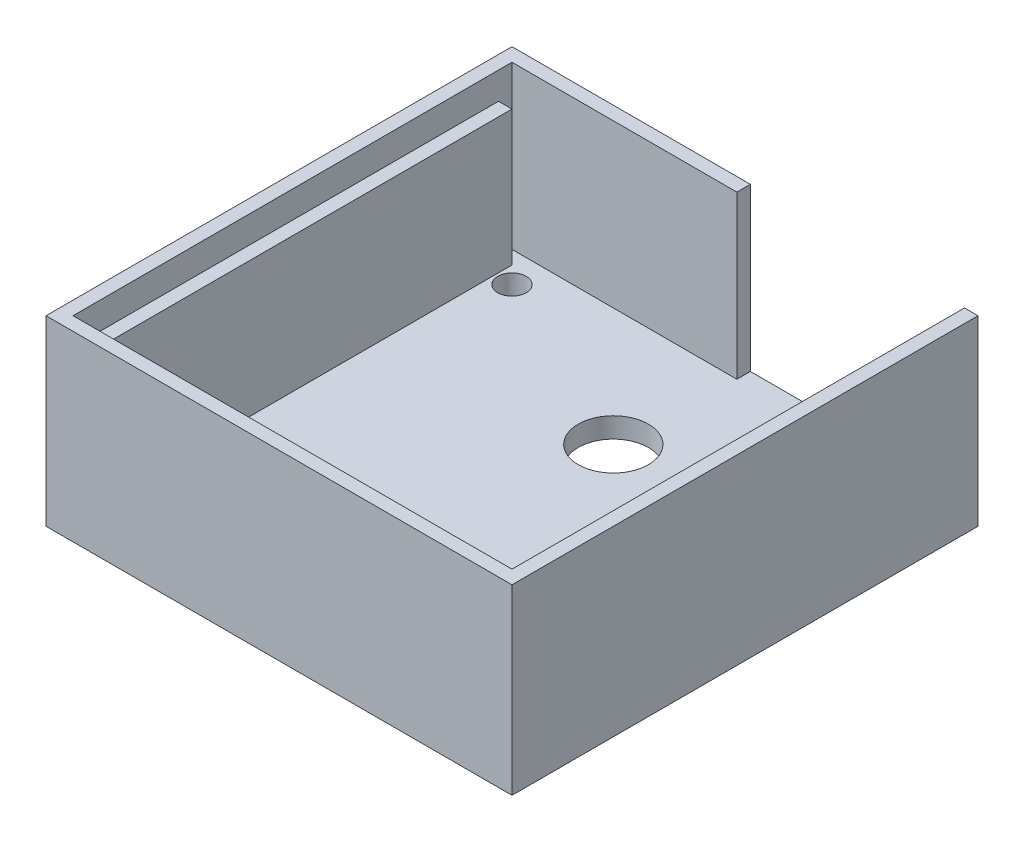
ISO-10303-21;
HEADER;
FILE_DESCRIPTION(('STEP AP214'),'2;1');
FILE_NAME('part.step','',(''),(''),'','','');
FILE_SCHEMA(('AUTOMOTIVE_DESIGN { 1 0 10303 214 1 1 1 1 }'));
ENDSEC;
DATA;
#1=APPLICATION_CONTEXT('core data for automotive mechanical design processes');
#2=APPLICATION_PROTOCOL_DEFINITION('international standard','automotive_design',2000,#1);
#3=PRODUCT_CONTEXT('',#1,'mechanical');
#4=PRODUCT('Part','Part','',(#3));
#5=PRODUCT_RELATED_PRODUCT_CATEGORY('part','',(#4));
#6=PRODUCT_DEFINITION_FORMATION('','',#4);
#7=PRODUCT_DEFINITION_CONTEXT('part definition',#1,'design');
#8=PRODUCT_DEFINITION('design','',#6,#7);
#9=PRODUCT_DEFINITION_SHAPE('','',#8);
#10=(LENGTH_UNIT() NAMED_UNIT(*) SI_UNIT(.MILLI.,.METRE.));
#11=(NAMED_UNIT(*) PLANE_ANGLE_UNIT() SI_UNIT($,.RADIAN.));
#12=(NAMED_UNIT(*) SI_UNIT($,.STERADIAN.) SOLID_ANGLE_UNIT());
#13=UNCERTAINTY_MEASURE_WITH_UNIT(LENGTH_MEASURE(1.E-05),#10,'distance_accuracy_value','');
#14=(GEOMETRIC_REPRESENTATION_CONTEXT(3) GLOBAL_UNCERTAINTY_ASSIGNED_CONTEXT((#13)) GLOBAL_UNIT_ASSIGNED_CONTEXT((#10,
#11,#12)) REPRESENTATION_CONTEXT('',''));
#15=CARTESIAN_POINT('',(0.,0.,0.));
#16=DIRECTION('',(0.,0.,1.));
#17=DIRECTION('',(1.,0.,0.));
#18=AXIS2_PLACEMENT_3D('',#15,#16,#17);
#19=CARTESIAN_POINT('',(0.,11.5,0.));
#20=DIRECTION('',(0.,1.,0.));
#21=DIRECTION('',(0.,0.,1.));
#22=AXIS2_PLACEMENT_3D('',#19,#20,#21);
#23=PLANE('',#22);
#24=DIRECTION('',(0.,0.,-1.));
#25=VECTOR('',#24,1.);
#26=CARTESIAN_POINT('',(14.5,11.5,-1.99999999999999));
#27=LINE('',#26,#25);
#28=CARTESIAN_POINT('',(14.5,11.5,-0.999999999999997));
#29=VERTEX_POINT('',#28);
#30=CARTESIAN_POINT('',(14.5,11.5,-1.99999999999999));
#31=VERTEX_POINT('',#30);
#32=EDGE_CURVE('E401',#29,#31,#27,.T.);
#33=ORIENTED_EDGE('',*,*,#32,.F.);
#34=DIRECTION('',(1.,0.,0.));
#35=VECTOR('',#34,1.);
#36=CARTESIAN_POINT('',(0.999999999999999,11.5,-0.999999999999997));
#37=LINE('',#36,#35);
#38=CARTESIAN_POINT('',(33.5,11.5,-1.));
#39=VERTEX_POINT('',#38);
#40=EDGE_CURVE('E217',#29,#39,#37,.T.);
#41=ORIENTED_EDGE('',*,*,#40,.T.);
#42=DIRECTION('',(0.,0.,-1.));
#43=VECTOR('',#42,1.);
#44=CARTESIAN_POINT('',(33.5,11.5,-1.));
#45=LINE('',#44,#43);
#46=CARTESIAN_POINT('',(33.5,11.5,-32.4840261778756));
#47=VERTEX_POINT('',#46);
#48=EDGE_CURVE('E222',#39,#47,#45,.T.);
#49=ORIENTED_EDGE('',*,*,#48,.T.);
#50=DIRECTION('',(1.,0.,0.));
#51=VECTOR('',#50,1.);
#52=CARTESIAN_POINT('',(0.,11.5,-32.4840261778756));
#53=LINE('',#52,#51);
#54=CARTESIAN_POINT('',(32.5,11.5,-32.4840261778756));
#55=VERTEX_POINT('',#54);
#56=EDGE_CURVE('E308',#55,#47,#53,.T.);
#57=ORIENTED_EDGE('',*,*,#56,.F.);
#58=DIRECTION('',(0.,0.,-1.));
#59=VECTOR('',#58,1.);
#60=CARTESIAN_POINT('',(32.5,11.5,-1.99999999999999));
#61=LINE('',#60,#59);
#62=CARTESIAN_POINT('',(32.5,11.5,-1.99999999999999));
#63=VERTEX_POINT('',#62);
#64=EDGE_CURVE('E358',#63,#55,#61,.T.);
#65=ORIENTED_EDGE('',*,*,#64,.F.);
#66=DIRECTION('',(1.,0.,0.));
#67=VECTOR('',#66,1.);
#68=CARTESIAN_POINT('',(1.99999999999998,11.5,-1.99999999999999));
#69=LINE('',#68,#67);
#70=EDGE_CURVE('E360',#31,#63,#69,.T.);
#71=ORIENTED_EDGE('',*,*,#70,.F.);
#72=EDGE_LOOP('',(#33,#41,#49,#57,#65,#71));
#73=FACE_BOUND('',#72,.T.);
#74=ADVANCED_FACE('F37',(#73),#23,.T.);
#75=CARTESIAN_POINT('',(1.99999999999998,-43.1335136523794,-1.99999999999999));
#76=DIRECTION('',(0.,0.,1.));
#77=DIRECTION('',(1.,0.,0.));
#78=AXIS2_PLACEMENT_3D('',#75,#76,#77);
#79=PLANE('',#78);
#80=DIRECTION('',(1.,0.,0.));
#81=VECTOR('',#80,1.);
#82=CARTESIAN_POINT('',(1.99999999999998,1.5,-1.99999999999999));
#83=LINE('',#82,#81);
#84=CARTESIAN_POINT('',(14.5,1.5,-1.99999999999999));
#85=VERTEX_POINT('',#84);
#86=CARTESIAN_POINT('',(32.5,1.5,-1.99999999999999));
#87=VERTEX_POINT('',#86);
#88=EDGE_CURVE('E201',#85,#87,#83,.T.);
#89=ORIENTED_EDGE('',*,*,#88,.F.);
#90=DIRECTION('',(0.,1.,0.));
#91=VECTOR('',#90,1.);
#92=CARTESIAN_POINT('',(14.5,1.5,-1.99999999999999));
#93=LINE('',#92,#91);
#94=EDGE_CURVE('E192',#85,#31,#93,.T.);
#95=ORIENTED_EDGE('',*,*,#94,.T.);
#96=ORIENTED_EDGE('',*,*,#70,.T.);
#97=DIRECTION('',(0.,1.,0.));
#98=VECTOR('',#97,1.);
#99=CARTESIAN_POINT('',(32.5,-43.1335136523794,-1.99999999999999));
#100=LINE('',#99,#98);
#101=EDGE_CURVE('E200',#87,#63,#100,.T.);
#102=ORIENTED_EDGE('',*,*,#101,.F.);
#103=EDGE_LOOP('',(#89,#95,#96,#102));
#104=FACE_BOUND('',#103,.T.);
#105=ADVANCED_FACE('F413',(#104),#79,.F.);
#106=CARTESIAN_POINT('',(0.,13.5,0.));
#107=DIRECTION('',(1.,0.,0.));
#108=DIRECTION('',(0.,0.,-1.));
#109=AXIS2_PLACEMENT_3D('',#106,#107,#108);
#110=PLANE('',#109);
#111=DIRECTION('',(0.,0.,1.));
#112=VECTOR('',#111,1.);
#113=CARTESIAN_POINT('',(0.,0.,0.));
#114=LINE('',#113,#112);
#115=CARTESIAN_POINT('',(0.,0.,-34.5));
#116=VERTEX_POINT('',#115);
#117=CARTESIAN_POINT('',(0.,0.,0.));
#118=VERTEX_POINT('',#117);
#119=EDGE_CURVE('E237',#116,#118,#114,.T.);
#120=ORIENTED_EDGE('',*,*,#119,.T.);
#121=DIRECTION('',(0.,-1.,0.));
#122=VECTOR('',#121,1.);
#123=CARTESIAN_POINT('',(0.,13.5,0.));
#124=LINE('',#123,#122);
#125=CARTESIAN_POINT('',(0.,13.5,0.));
#126=VERTEX_POINT('',#125);
#127=EDGE_CURVE('E45',#126,#118,#124,.T.);
#128=ORIENTED_EDGE('',*,*,#127,.F.);
#129=DIRECTION('',(0.,0.,1.));
#130=VECTOR('',#129,1.);
#131=CARTESIAN_POINT('',(0.,13.5,0.));
#132=LINE('',#131,#130);
#133=CARTESIAN_POINT('',(0.,13.5,-34.5));
#134=VERTEX_POINT('',#133);
#135=EDGE_CURVE('E242',#134,#126,#132,.T.);
#136=ORIENTED_EDGE('',*,*,#135,.F.);
#137=DIRECTION('',(0.,-1.,0.));
#138=VECTOR('',#137,1.);
#139=CARTESIAN_POINT('',(0.,13.5,-34.5));
#140=LINE('',#139,#138);
#141=EDGE_CURVE('E254',#134,#116,#140,.T.);
#142=ORIENTED_EDGE('',*,*,#141,.T.);
#143=EDGE_LOOP('',(#120,#128,#136,#142));
#144=FACE_BOUND('',#143,.T.);
#145=ADVANCED_FACE('F39',(#144),#110,.F.);
#146=CARTESIAN_POINT('',(0.,13.5,0.));
#147=DIRECTION('',(0.,0.,-1.));
#148=DIRECTION('',(-1.,0.,0.));
#149=AXIS2_PLACEMENT_3D('',#146,#147,#148);
#150=PLANE('',#149);
#151=DIRECTION('',(1.,0.,0.));
#152=VECTOR('',#151,1.);
#153=CARTESIAN_POINT('',(0.,0.,0.));
#154=LINE('',#153,#152);
#155=CARTESIAN_POINT('',(34.5,0.,0.));
#156=VERTEX_POINT('',#155);
#157=EDGE_CURVE('E257',#118,#156,#154,.T.);
#158=ORIENTED_EDGE('',*,*,#157,.T.);
#159=DIRECTION('',(0.,-1.,0.));
#160=VECTOR('',#159,1.);
#161=CARTESIAN_POINT('',(34.5,13.5,0.));
#162=LINE('',#161,#160);
#163=CARTESIAN_POINT('',(34.5,13.5,0.));
#164=VERTEX_POINT('',#163);
#165=EDGE_CURVE('E267',#164,#156,#162,.T.);
#166=ORIENTED_EDGE('',*,*,#165,.F.);
#167=DIRECTION('',(1.,0.,0.));
#168=VECTOR('',#167,1.);
#169=CARTESIAN_POINT('',(0.,13.5,0.));
#170=LINE('',#169,#168);
#171=EDGE_CURVE('E245',#126,#164,#170,.T.);
#172=ORIENTED_EDGE('',*,*,#171,.F.);
#173=ORIENTED_EDGE('',*,*,#127,.T.);
#174=EDGE_LOOP('',(#158,#166,#172,#173));
#175=FACE_BOUND('',#174,.T.);
#176=ADVANCED_FACE('F272',(#175),#150,.F.);
#177=CARTESIAN_POINT('',(34.5,13.5,0.));
#178=DIRECTION('',(-1.,0.,0.));
#179=DIRECTION('',(0.,0.,1.));
#180=AXIS2_PLACEMENT_3D('',#177,#178,#179);
#181=PLANE('',#180);
#182=DIRECTION('',(0.,0.,-1.));
#183=VECTOR('',#182,1.);
#184=CARTESIAN_POINT('',(34.5,0.,0.));
#185=LINE('',#184,#183);
#186=CARTESIAN_POINT('',(34.5,0.,-34.5));
#187=VERTEX_POINT('',#186);
#188=EDGE_CURVE('E259',#156,#187,#185,.T.);
#189=ORIENTED_EDGE('',*,*,#188,.T.);
#190=DIRECTION('',(0.,-1.,0.));
#191=VECTOR('',#190,1.);
#192=CARTESIAN_POINT('',(34.5,13.5,-34.5));
#193=LINE('',#192,#191);
#194=CARTESIAN_POINT('',(34.5,13.5,-34.5));
#195=VERTEX_POINT('',#194);
#196=EDGE_CURVE('E264',#195,#187,#193,.T.);
#197=ORIENTED_EDGE('',*,*,#196,.F.);
#198=DIRECTION('',(0.,0.,-1.));
#199=VECTOR('',#198,1.);
#200=CARTESIAN_POINT('',(34.5,13.5,0.));
#201=LINE('',#200,#199);
#202=EDGE_CURVE('E248',#164,#195,#201,.T.);
#203=ORIENTED_EDGE('',*,*,#202,.F.);
#204=ORIENTED_EDGE('',*,*,#165,.T.);
#205=EDGE_LOOP('',(#189,#197,#203,#204));
#206=FACE_BOUND('',#205,.T.);
#207=ADVANCED_FACE('F284',(#206),#181,.F.);
#208=CARTESIAN_POINT('',(0.,13.5,-34.5));
#209=DIRECTION('',(0.,0.,1.));
#210=DIRECTION('',(1.,0.,0.));
#211=AXIS2_PLACEMENT_3D('',#208,#209,#210);
#212=PLANE('',#211);
#213=DIRECTION('',(-1.,0.,0.));
#214=VECTOR('',#213,1.);
#215=CARTESIAN_POINT('',(17.65,1.5,-34.5));
#216=LINE('',#215,#214);
#217=CARTESIAN_POINT('',(33.5,1.5,-34.5));
#218=VERTEX_POINT('',#217);
#219=CARTESIAN_POINT('',(17.65,1.5,-34.5));
#220=VERTEX_POINT('',#219);
#221=EDGE_CURVE('E303',#218,#220,#216,.T.);
#222=ORIENTED_EDGE('',*,*,#221,.F.);
#223=DIRECTION('',(0.,1.,0.));
#224=VECTOR('',#223,1.);
#225=CARTESIAN_POINT('',(33.5,-14.4776922755287,-34.5));
#226=LINE('',#225,#224);
#227=CARTESIAN_POINT('',(33.5,13.5,-34.5));
#228=VERTEX_POINT('',#227);
#229=EDGE_CURVE('E291',#218,#228,#226,.T.);
#230=ORIENTED_EDGE('',*,*,#229,.T.);
#231=DIRECTION('',(-1.,0.,0.));
#232=VECTOR('',#231,1.);
#233=CARTESIAN_POINT('',(0.,13.5,-34.5));
#234=LINE('',#233,#232);
#235=EDGE_CURVE('E251',#195,#228,#234,.T.);
#236=ORIENTED_EDGE('',*,*,#235,.F.);
#237=ORIENTED_EDGE('',*,*,#196,.T.);
#238=DIRECTION('',(-1.,0.,0.));
#239=VECTOR('',#238,1.);
#240=CARTESIAN_POINT('',(0.,0.,-34.5));
#241=LINE('',#240,#239);
#242=EDGE_CURVE('E246',#187,#116,#241,.T.);
#243=ORIENTED_EDGE('',*,*,#242,.T.);
#244=ORIENTED_EDGE('',*,*,#141,.F.);
#245=CARTESIAN_POINT('',(17.65,13.5,-34.5));
#246=VERTEX_POINT('',#245);
#247=EDGE_CURVE('E250',#246,#134,#234,.T.);
#248=ORIENTED_EDGE('',*,*,#247,.F.);
#249=DIRECTION('',(0.,1.,0.));
#250=VECTOR('',#249,1.);
#251=CARTESIAN_POINT('',(17.65,-14.4776922755287,-34.5));
#252=LINE('',#251,#250);
#253=EDGE_CURVE('E301',#220,#246,#252,.T.);
#254=ORIENTED_EDGE('',*,*,#253,.F.);
#255=EDGE_LOOP('',(#222,#230,#236,#237,#243,#244,#248,#254));
#256=FACE_BOUND('',#255,.T.);
#257=ADVANCED_FACE('F289',(#256),#212,.F.);
#258=CARTESIAN_POINT('',(0.,13.5,0.));
#259=DIRECTION('',(0.,-1.,0.));
#260=DIRECTION('',(0.,0.,-1.));
#261=AXIS2_PLACEMENT_3D('',#258,#259,#260);
#262=PLANE('',#261);
#263=ORIENTED_EDGE('',*,*,#235,.T.);
#264=DIRECTION('',(0.,0.,-1.));
#265=VECTOR('',#264,1.);
#266=CARTESIAN_POINT('',(33.5,13.5,-1.));
#267=LINE('',#266,#265);
#268=CARTESIAN_POINT('',(33.5,13.5,-1.));
#269=VERTEX_POINT('',#268);
#270=EDGE_CURVE('E218',#269,#228,#267,.T.);
#271=ORIENTED_EDGE('',*,*,#270,.F.);
#272=DIRECTION('',(1.,0.,0.));
#273=VECTOR('',#272,1.);
#274=CARTESIAN_POINT('',(0.999999999999999,13.5,-0.999999999999997));
#275=LINE('',#274,#273);
#276=CARTESIAN_POINT('',(0.999999999999999,13.5,-0.999999999999997));
#277=VERTEX_POINT('',#276);
#278=EDGE_CURVE('E231',#277,#269,#275,.T.);
#279=ORIENTED_EDGE('',*,*,#278,.F.);
#280=DIRECTION('',(0.,0.,1.));
#281=VECTOR('',#280,1.);
#282=CARTESIAN_POINT('',(0.999999999999997,13.5,-33.5));
#283=LINE('',#282,#281);
#284=CARTESIAN_POINT('',(0.999999999999997,13.5,-33.5));
#285=VERTEX_POINT('',#284);
#286=EDGE_CURVE('E228',#285,#277,#283,.T.);
#287=ORIENTED_EDGE('',*,*,#286,.F.);
#288=DIRECTION('',(-1.,0.,0.));
#289=VECTOR('',#288,1.);
#290=CARTESIAN_POINT('',(33.5,13.5,-33.5));
#291=LINE('',#290,#289);
#292=CARTESIAN_POINT('',(17.65,13.5,-33.5));
#293=VERTEX_POINT('',#292);
#294=EDGE_CURVE('E226',#293,#285,#291,.T.);
#295=ORIENTED_EDGE('',*,*,#294,.F.);
#296=DIRECTION('',(0.,0.,1.));
#297=VECTOR('',#296,1.);
#298=CARTESIAN_POINT('',(17.65,13.5,-34.5));
#299=LINE('',#298,#297);
#300=EDGE_CURVE('E299',#246,#293,#299,.T.);
#301=ORIENTED_EDGE('',*,*,#300,.F.);
#302=ORIENTED_EDGE('',*,*,#247,.T.);
#303=ORIENTED_EDGE('',*,*,#135,.T.);
#304=ORIENTED_EDGE('',*,*,#171,.T.);
#305=ORIENTED_EDGE('',*,*,#202,.T.);
#306=EDGE_LOOP('',(#263,#271,#279,#287,#295,#301,#302,#303,#304,#305));
#307=FACE_BOUND('',#306,.T.);
#308=ADVANCED_FACE('F294',(#307),#262,.F.);
#309=CARTESIAN_POINT('',(0.,0.,0.));
#310=DIRECTION('',(0.,-1.,0.));
#311=DIRECTION('',(0.,0.,-1.));
#312=AXIS2_PLACEMENT_3D('',#309,#310,#311);
#313=PLANE('',#312);
#314=CARTESIAN_POINT('',(31.25,0.,-31.25));
#315=DIRECTION('',(0.,-1.,0.));
#316=DIRECTION('',(0.,0.,-1.));
#317=AXIS2_PLACEMENT_3D('',#314,#315,#316);
#318=CIRCLE('',#317,1.0552593244145);
#319=CARTESIAN_POINT('',(31.25,0.,-32.3052593244145));
#320=VERTEX_POINT('',#319);
#321=EDGE_CURVE('E355',#320,#320,#318,.T.);
#322=ORIENTED_EDGE('',*,*,#321,.F.);
#323=EDGE_LOOP('',(#322));
#324=FACE_BOUND('',#323,.T.);
#325=CARTESIAN_POINT('',(31.25,0.,-3.24999999999999));
#326=DIRECTION('',(0.,-1.,0.));
#327=DIRECTION('',(0.,0.,-1.));
#328=AXIS2_PLACEMENT_3D('',#325,#326,#327);
#329=CIRCLE('',#328,1.0552593244145);
#330=CARTESIAN_POINT('',(31.25,0.,-4.30525932441449));
#331=VERTEX_POINT('',#330);
#332=EDGE_CURVE('E352',#331,#331,#329,.T.);
#333=ORIENTED_EDGE('',*,*,#332,.F.);
#334=EDGE_LOOP('',(#333));
#335=FACE_BOUND('',#334,.T.);
#336=CARTESIAN_POINT('',(3.24999999999999,0.,-3.25));
#337=DIRECTION('',(0.,-1.,0.));
#338=DIRECTION('',(0.,0.,-1.));
#339=AXIS2_PLACEMENT_3D('',#336,#337,#338);
#340=CIRCLE('',#339,1.0552593244145);
#341=CARTESIAN_POINT('',(3.24999999999999,0.,-4.30525932441449));
#342=VERTEX_POINT('',#341);
#343=EDGE_CURVE('E349',#342,#342,#340,.T.);
#344=ORIENTED_EDGE('',*,*,#343,.F.);
#345=EDGE_LOOP('',(#344));
#346=FACE_BOUND('',#345,.T.);
#347=CARTESIAN_POINT('',(17.25,0.,-24.75));
#348=DIRECTION('',(0.,-1.,0.));
#349=DIRECTION('',(0.,0.,-1.));
#350=AXIS2_PLACEMENT_3D('',#347,#348,#349);
#351=CIRCLE('',#350,2.6);
#352=CARTESIAN_POINT('',(17.25,0.,-27.35));
#353=VERTEX_POINT('',#352);
#354=EDGE_CURVE('E346',#353,#353,#351,.T.);
#355=ORIENTED_EDGE('',*,*,#354,.F.);
#356=EDGE_LOOP('',(#355));
#357=FACE_BOUND('',#356,.T.);
#358=CARTESIAN_POINT('',(17.25,0.,-9.74999999999999));
#359=DIRECTION('',(0.,-1.,0.));
#360=DIRECTION('',(0.,0.,-1.));
#361=AXIS2_PLACEMENT_3D('',#358,#359,#360);
#362=CIRCLE('',#361,2.59999999999999);
#363=CARTESIAN_POINT('',(17.25,0.,-12.35));
#364=VERTEX_POINT('',#363);
#365=EDGE_CURVE('E343',#364,#364,#362,.T.);
#366=ORIENTED_EDGE('',*,*,#365,.F.);
#367=EDGE_LOOP('',(#366));
#368=FACE_BOUND('',#367,.T.);
#369=CARTESIAN_POINT('',(3.24999999999999,0.,-31.25));
#370=DIRECTION('',(0.,-1.,0.));
#371=DIRECTION('',(0.,0.,-1.));
#372=AXIS2_PLACEMENT_3D('',#369,#370,#371);
#373=CIRCLE('',#372,1.0552593244145);
#374=CARTESIAN_POINT('',(3.24999999999999,0.,-32.3052593244145));
#375=VERTEX_POINT('',#374);
#376=EDGE_CURVE('E340',#375,#375,#373,.T.);
#377=ORIENTED_EDGE('',*,*,#376,.F.);
#378=EDGE_LOOP('',(#377));
#379=FACE_BOUND('',#378,.T.);
#380=ORIENTED_EDGE('',*,*,#119,.F.);
#381=ORIENTED_EDGE('',*,*,#242,.F.);
#382=ORIENTED_EDGE('',*,*,#188,.F.);
#383=ORIENTED_EDGE('',*,*,#157,.F.);
#384=EDGE_LOOP('',(#380,#381,#382,#383));
#385=FACE_BOUND('',#384,.T.);
#386=ADVANCED_FACE('F280',(#324,#335,#346,#357,#368,#379,#385),#313,.T.);
#387=CARTESIAN_POINT('',(33.5,11.5,-33.5));
#388=DIRECTION('',(0.,0.,-1.));
#389=DIRECTION('',(-1.,0.,0.));
#390=AXIS2_PLACEMENT_3D('',#387,#388,#389);
#391=PLANE('',#390);
#392=DIRECTION('',(0.,1.,0.));
#393=VECTOR('',#392,1.);
#394=CARTESIAN_POINT('',(0.999999999999997,11.5,-33.5));
#395=LINE('',#394,#393);
#396=CARTESIAN_POINT('',(0.999999999999997,1.5,-33.5));
#397=VERTEX_POINT('',#396);
#398=EDGE_CURVE('E225',#397,#285,#395,.T.);
#399=ORIENTED_EDGE('',*,*,#398,.F.);
#400=DIRECTION('',(-1.,0.,0.));
#401=VECTOR('',#400,1.);
#402=CARTESIAN_POINT('',(17.65,1.5,-33.5));
#403=LINE('',#402,#401);
#404=CARTESIAN_POINT('',(17.65,1.5,-33.5));
#405=VERTEX_POINT('',#404);
#406=EDGE_CURVE('E387',#405,#397,#403,.T.);
#407=ORIENTED_EDGE('',*,*,#406,.F.);
#408=DIRECTION('',(0.,1.,0.));
#409=VECTOR('',#408,1.);
#410=CARTESIAN_POINT('',(17.65,11.5,-33.5));
#411=LINE('',#410,#409);
#412=EDGE_CURVE('E319',#405,#293,#411,.T.);
#413=ORIENTED_EDGE('',*,*,#412,.T.);
#414=ORIENTED_EDGE('',*,*,#294,.T.);
#415=EDGE_LOOP('',(#399,#407,#413,#414));
#416=FACE_BOUND('',#415,.T.);
#417=ADVANCED_FACE('F442',(#416),#391,.F.);
#418=CARTESIAN_POINT('',(33.5,11.5,-1.));
#419=DIRECTION('',(1.,0.,0.));
#420=DIRECTION('',(0.,0.,-1.));
#421=AXIS2_PLACEMENT_3D('',#418,#419,#420);
#422=PLANE('',#421);
#423=ORIENTED_EDGE('',*,*,#270,.T.);
#424=ORIENTED_EDGE('',*,*,#229,.F.);
#425=DIRECTION('',(0.,0.,-1.));
#426=VECTOR('',#425,1.);
#427=CARTESIAN_POINT('',(33.5,1.5,-34.5));
#428=LINE('',#427,#426);
#429=CARTESIAN_POINT('',(33.5,1.5,-32.4840261778756));
#430=VERTEX_POINT('',#429);
#431=EDGE_CURVE('E313',#430,#218,#428,.T.);
#432=ORIENTED_EDGE('',*,*,#431,.F.);
#433=DIRECTION('',(0.,1.,0.));
#434=VECTOR('',#433,1.);
#435=CARTESIAN_POINT('',(33.5,-14.4776922755287,-32.4840261778756));
#436=LINE('',#435,#434);
#437=EDGE_CURVE('E315',#430,#47,#436,.T.);
#438=ORIENTED_EDGE('',*,*,#437,.T.);
#439=ORIENTED_EDGE('',*,*,#48,.F.);
#440=DIRECTION('',(0.,1.,0.));
#441=VECTOR('',#440,1.);
#442=CARTESIAN_POINT('',(33.5,11.5,-1.));
#443=LINE('',#442,#441);
#444=EDGE_CURVE('E235',#39,#269,#443,.T.);
#445=ORIENTED_EDGE('',*,*,#444,.T.);
#446=EDGE_LOOP('',(#423,#424,#432,#438,#439,#445));
#447=FACE_BOUND('',#446,.T.);
#448=ADVANCED_FACE('F377',(#447),#422,.F.);
#449=CARTESIAN_POINT('',(0.999999999999999,11.5,-0.999999999999997));
#450=DIRECTION('',(0.,0.,1.));
#451=DIRECTION('',(1.,0.,0.));
#452=AXIS2_PLACEMENT_3D('',#449,#450,#451);
#453=PLANE('',#452);
#454=ORIENTED_EDGE('',*,*,#278,.T.);
#455=ORIENTED_EDGE('',*,*,#444,.F.);
#456=ORIENTED_EDGE('',*,*,#40,.F.);
#457=DIRECTION('',(0.,1.,0.));
#458=VECTOR('',#457,1.);
#459=CARTESIAN_POINT('',(14.5,1.5,-0.999999999999997));
#460=LINE('',#459,#458);
#461=CARTESIAN_POINT('',(14.5,1.5,-0.999999999999997));
#462=VERTEX_POINT('',#461);
#463=EDGE_CURVE('E388',#462,#29,#460,.T.);
#464=ORIENTED_EDGE('',*,*,#463,.F.);
#465=DIRECTION('',(1.,0.,0.));
#466=VECTOR('',#465,1.);
#467=CARTESIAN_POINT('',(14.5,1.5,-0.999999999999997));
#468=LINE('',#467,#466);
#469=CARTESIAN_POINT('',(5.,1.5,-0.999999999999997));
#470=VERTEX_POINT('',#469);
#471=EDGE_CURVE('E182',#470,#462,#468,.T.);
#472=ORIENTED_EDGE('',*,*,#471,.F.);
#473=DIRECTION('',(0.,1.,0.));
#474=VECTOR('',#473,1.);
#475=CARTESIAN_POINT('',(5.,1.5,-0.999999999999997));
#476=LINE('',#475,#474);
#477=CARTESIAN_POINT('',(5.,11.5,-0.999999999999997));
#478=VERTEX_POINT('',#477);
#479=EDGE_CURVE('E179',#470,#478,#476,.T.);
#480=ORIENTED_EDGE('',*,*,#479,.T.);
#481=CARTESIAN_POINT('',(0.999999999999999,11.5,-0.999999999999997));
#482=VERTEX_POINT('',#481);
#483=EDGE_CURVE('E219',#482,#478,#37,.T.);
#484=ORIENTED_EDGE('',*,*,#483,.F.);
#485=DIRECTION('',(0.,1.,0.));
#486=VECTOR('',#485,1.);
#487=CARTESIAN_POINT('',(0.999999999999999,11.5,-0.999999999999997));
#488=LINE('',#487,#486);
#489=EDGE_CURVE('E238',#482,#277,#488,.T.);
#490=ORIENTED_EDGE('',*,*,#489,.T.);
#491=EDGE_LOOP('',(#454,#455,#456,#464,#472,#480,#484,#490));
#492=FACE_BOUND('',#491,.T.);
#493=ADVANCED_FACE('F405',(#492),#453,.F.);
#494=CARTESIAN_POINT('',(0.999999999999997,11.5,-33.5));
#495=DIRECTION('',(-1.,0.,0.));
#496=DIRECTION('',(0.,0.,1.));
#497=AXIS2_PLACEMENT_3D('',#494,#495,#496);
#498=PLANE('',#497);
#499=ORIENTED_EDGE('',*,*,#286,.T.);
#500=ORIENTED_EDGE('',*,*,#489,.F.);
#501=DIRECTION('',(0.,0.,1.));
#502=VECTOR('',#501,1.);
#503=CARTESIAN_POINT('',(0.999999999999997,11.5,-33.5));
#504=LINE('',#503,#502);
#505=CARTESIAN_POINT('',(0.999999999999997,11.5,-32.5));
#506=VERTEX_POINT('',#505);
#507=EDGE_CURVE('E215',#506,#482,#504,.T.);
#508=ORIENTED_EDGE('',*,*,#507,.F.);
#509=DIRECTION('',(0.,1.,0.));
#510=VECTOR('',#509,1.);
#511=CARTESIAN_POINT('',(0.999999999999997,1.5,-32.5));
#512=LINE('',#511,#510);
#513=CARTESIAN_POINT('',(0.999999999999997,1.5,-32.5));
#514=VERTEX_POINT('',#513);
#515=EDGE_CURVE('E380',#514,#506,#512,.T.);
#516=ORIENTED_EDGE('',*,*,#515,.F.);
#517=DIRECTION('',(0.,0.,1.));
#518=VECTOR('',#517,1.);
#519=CARTESIAN_POINT('',(0.999999999999997,1.5,-32.5));
#520=LINE('',#519,#518);
#521=EDGE_CURVE('E390',#397,#514,#520,.T.);
#522=ORIENTED_EDGE('',*,*,#521,.F.);
#523=ORIENTED_EDGE('',*,*,#398,.T.);
#524=EDGE_LOOP('',(#499,#500,#508,#516,#522,#523));
#525=FACE_BOUND('',#524,.T.);
#526=ADVANCED_FACE('F438',(#525),#498,.F.);
#527=DIRECTION('',(0.,0.,1.));
#528=VECTOR('',#527,1.);
#529=CARTESIAN_POINT('',(5.,11.5,-1.99999999999999));
#530=LINE('',#529,#528);
#531=CARTESIAN_POINT('',(5.,11.5,-1.99999999999999));
#532=VERTEX_POINT('',#531);
#533=EDGE_CURVE('E399',#532,#478,#530,.T.);
#534=ORIENTED_EDGE('',*,*,#533,.F.);
#535=CARTESIAN_POINT('',(1.99999999999998,11.5,-1.99999999999999));
#536=VERTEX_POINT('',#535);
#537=EDGE_CURVE('E191',#536,#532,#69,.T.);
#538=ORIENTED_EDGE('',*,*,#537,.F.);
#539=DIRECTION('',(0.,0.,1.));
#540=VECTOR('',#539,1.);
#541=CARTESIAN_POINT('',(1.99999999999998,11.5,-1.99999999999999));
#542=LINE('',#541,#540);
#543=CARTESIAN_POINT('',(1.99999999999998,11.5,-32.5));
#544=VERTEX_POINT('',#543);
#545=EDGE_CURVE('E361',#544,#536,#542,.T.);
#546=ORIENTED_EDGE('',*,*,#545,.F.);
#547=DIRECTION('',(1.,0.,0.));
#548=VECTOR('',#547,1.);
#549=CARTESIAN_POINT('',(17.65,11.5,-32.5));
#550=LINE('',#549,#548);
#551=EDGE_CURVE('E385',#506,#544,#550,.T.);
#552=ORIENTED_EDGE('',*,*,#551,.F.);
#553=ORIENTED_EDGE('',*,*,#507,.T.);
#554=ORIENTED_EDGE('',*,*,#483,.T.);
#555=EDGE_LOOP('',(#534,#538,#546,#552,#553,#554));
#556=FACE_BOUND('',#555,.T.);
#557=ADVANCED_FACE('F421',(#556),#23,.T.);
#558=CARTESIAN_POINT('',(0.,1.5,0.));
#559=DIRECTION('',(0.,-1.,0.));
#560=DIRECTION('',(0.,0.,-1.));
#561=AXIS2_PLACEMENT_3D('',#558,#559,#560);
#562=PLANE('',#561);
#563=DIRECTION('',(1.,0.,0.));
#564=VECTOR('',#563,1.);
#565=CARTESIAN_POINT('',(17.65,1.5,-32.5));
#566=LINE('',#565,#564);
#567=CARTESIAN_POINT('',(1.99999999999998,1.5,-32.5));
#568=VERTEX_POINT('',#567);
#569=EDGE_CURVE('E384',#514,#568,#566,.T.);
#570=ORIENTED_EDGE('',*,*,#569,.T.);
#571=DIRECTION('',(0.,0.,1.));
#572=VECTOR('',#571,1.);
#573=CARTESIAN_POINT('',(1.99999999999998,1.5,-1.99999999999999));
#574=LINE('',#573,#572);
#575=CARTESIAN_POINT('',(1.99999999999998,1.5,-1.99999999999999));
#576=VERTEX_POINT('',#575);
#577=EDGE_CURVE('E199',#568,#576,#574,.T.);
#578=ORIENTED_EDGE('',*,*,#577,.T.);
#579=CARTESIAN_POINT('',(5.,1.5,-1.99999999999999));
#580=VERTEX_POINT('',#579);
#581=EDGE_CURVE('E188',#576,#580,#83,.T.);
#582=ORIENTED_EDGE('',*,*,#581,.T.);
#583=DIRECTION('',(0.,0.,1.));
#584=VECTOR('',#583,1.);
#585=CARTESIAN_POINT('',(5.,1.5,-1.99999999999999));
#586=LINE('',#585,#584);
#587=EDGE_CURVE('E173',#580,#470,#586,.T.);
#588=ORIENTED_EDGE('',*,*,#587,.T.);
#589=ORIENTED_EDGE('',*,*,#471,.T.);
#590=DIRECTION('',(0.,0.,-1.));
#591=VECTOR('',#590,1.);
#592=CARTESIAN_POINT('',(14.5,1.5,-1.99999999999999));
#593=LINE('',#592,#591);
#594=EDGE_CURVE('E52',#462,#85,#593,.T.);
#595=ORIENTED_EDGE('',*,*,#594,.T.);
#596=ORIENTED_EDGE('',*,*,#88,.T.);
#597=DIRECTION('',(0.,0.,-1.));
#598=VECTOR('',#597,1.);
#599=CARTESIAN_POINT('',(32.5,1.5,-1.99999999999999));
#600=LINE('',#599,#598);
#601=CARTESIAN_POINT('',(32.5,1.5,-32.4840261778756));
#602=VERTEX_POINT('',#601);
#603=EDGE_CURVE('E204',#87,#602,#600,.T.);
#604=ORIENTED_EDGE('',*,*,#603,.T.);
#605=DIRECTION('',(1.,0.,0.));
#606=VECTOR('',#605,1.);
#607=CARTESIAN_POINT('',(17.65,1.5,-32.4840261778756));
#608=LINE('',#607,#606);
#609=EDGE_CURVE('E60',#602,#430,#608,.T.);
#610=ORIENTED_EDGE('',*,*,#609,.T.);
#611=ORIENTED_EDGE('',*,*,#431,.T.);
#612=ORIENTED_EDGE('',*,*,#221,.T.);
#613=DIRECTION('',(0.,0.,1.));
#614=VECTOR('',#613,1.);
#615=CARTESIAN_POINT('',(17.65,1.5,-34.5));
#616=LINE('',#615,#614);
#617=EDGE_CURVE('E305',#220,#405,#616,.T.);
#618=ORIENTED_EDGE('',*,*,#617,.T.);
#619=ORIENTED_EDGE('',*,*,#406,.T.);
#620=ORIENTED_EDGE('',*,*,#521,.T.);
#621=EDGE_LOOP('',(#570,#578,#582,#588,#589,#595,#596,#604,#610,#611,#612,#618,#619,#620));
#622=FACE_BOUND('',#621,.T.);
#623=CARTESIAN_POINT('',(31.25,1.5,-31.25));
#624=DIRECTION('',(0.,1.,0.));
#625=DIRECTION('',(0.,0.,-1.));
#626=AXIS2_PLACEMENT_3D('',#623,#624,#625);
#627=CIRCLE('',#626,1.0552593244145);
#628=CARTESIAN_POINT('',(31.25,1.5,-32.3052593244145));
#629=VERTEX_POINT('',#628);
#630=EDGE_CURVE('E326',#629,#629,#627,.T.);
#631=ORIENTED_EDGE('',*,*,#630,.F.);
#632=EDGE_LOOP('',(#631));
#633=FACE_BOUND('',#632,.T.);
#634=CARTESIAN_POINT('',(31.25,1.5,-3.24999999999999));
#635=DIRECTION('',(0.,1.,0.));
#636=DIRECTION('',(0.,0.,1.));
#637=AXIS2_PLACEMENT_3D('',#634,#635,#636);
#638=CIRCLE('',#637,1.0552593244145);
#639=CARTESIAN_POINT('',(31.25,1.5,-2.19474067558549));
#640=VERTEX_POINT('',#639);
#641=EDGE_CURVE('E330',#640,#640,#638,.T.);
#642=ORIENTED_EDGE('',*,*,#641,.F.);
#643=EDGE_LOOP('',(#642));
#644=FACE_BOUND('',#643,.T.);
#645=CARTESIAN_POINT('',(3.24999999999999,1.5,-3.25));
#646=DIRECTION('',(0.,1.,0.));
#647=DIRECTION('',(0.,0.,-1.));
#648=AXIS2_PLACEMENT_3D('',#645,#646,#647);
#649=CIRCLE('',#648,1.0552593244145);
#650=CARTESIAN_POINT('',(3.24999999999999,1.5,-4.30525932441449));
#651=VERTEX_POINT('',#650);
#652=EDGE_CURVE('E333',#651,#651,#649,.T.);
#653=ORIENTED_EDGE('',*,*,#652,.F.);
#654=EDGE_LOOP('',(#653));
#655=FACE_BOUND('',#654,.T.);
#656=CARTESIAN_POINT('',(17.25,1.5,-24.75));
#657=DIRECTION('',(0.,1.,0.));
#658=DIRECTION('',(0.,0.,1.));
#659=AXIS2_PLACEMENT_3D('',#656,#657,#658);
#660=CIRCLE('',#659,2.6);
#661=CARTESIAN_POINT('',(17.25,1.5,-22.15));
#662=VERTEX_POINT('',#661);
#663=EDGE_CURVE('E325',#662,#662,#660,.T.);
#664=ORIENTED_EDGE('',*,*,#663,.F.);
#665=EDGE_LOOP('',(#664));
#666=FACE_BOUND('',#665,.T.);
#667=CARTESIAN_POINT('',(17.25,1.5,-9.74999999999999));
#668=DIRECTION('',(0.,1.,0.));
#669=DIRECTION('',(0.,0.,-1.));
#670=AXIS2_PLACEMENT_3D('',#667,#668,#669);
#671=CIRCLE('',#670,2.59999999999999);
#672=CARTESIAN_POINT('',(17.25,1.5,-12.35));
#673=VERTEX_POINT('',#672);
#674=EDGE_CURVE('E322',#673,#673,#671,.T.);
#675=ORIENTED_EDGE('',*,*,#674,.F.);
#676=EDGE_LOOP('',(#675));
#677=FACE_BOUND('',#676,.T.);
#678=CARTESIAN_POINT('',(3.24999999999999,1.5,-31.25));
#679=DIRECTION('',(0.,1.,0.));
#680=DIRECTION('',(0.,0.,1.));
#681=AXIS2_PLACEMENT_3D('',#678,#679,#680);
#682=CIRCLE('',#681,1.0552593244145);
#683=CARTESIAN_POINT('',(3.24999999999999,1.5,-30.1947406755855));
#684=VERTEX_POINT('',#683);
#685=EDGE_CURVE('E329',#684,#684,#682,.T.);
#686=ORIENTED_EDGE('',*,*,#685,.F.);
#687=EDGE_LOOP('',(#686));
#688=FACE_BOUND('',#687,.T.);
#689=ADVANCED_FACE('F196',(#622,#633,#644,#655,#666,#677,#688),#562,.F.);
#690=CARTESIAN_POINT('',(1.99999999999998,-43.1335136523794,-1.99999999999999));
#691=DIRECTION('',(-1.,0.,0.));
#692=DIRECTION('',(0.,0.,1.));
#693=AXIS2_PLACEMENT_3D('',#690,#691,#692);
#694=PLANE('',#693);
#695=DIRECTION('',(0.,1.,0.));
#696=VECTOR('',#695,1.);
#697=CARTESIAN_POINT('',(1.99999999999998,-43.1335136523794,-32.5));
#698=LINE('',#697,#696);
#699=EDGE_CURVE('E210',#568,#544,#698,.T.);
#700=ORIENTED_EDGE('',*,*,#699,.T.);
#701=ORIENTED_EDGE('',*,*,#545,.T.);
#702=DIRECTION('',(0.,1.,0.));
#703=VECTOR('',#702,1.);
#704=CARTESIAN_POINT('',(1.99999999999998,-43.1335136523794,-1.99999999999999));
#705=LINE('',#704,#703);
#706=EDGE_CURVE('E206',#576,#536,#705,.T.);
#707=ORIENTED_EDGE('',*,*,#706,.F.);
#708=ORIENTED_EDGE('',*,*,#577,.F.);
#709=EDGE_LOOP('',(#700,#701,#707,#708));
#710=FACE_BOUND('',#709,.T.);
#711=ADVANCED_FACE('F425',(#710),#694,.F.);
#712=ORIENTED_EDGE('',*,*,#537,.T.);
#713=DIRECTION('',(0.,1.,0.));
#714=VECTOR('',#713,1.);
#715=CARTESIAN_POINT('',(5.,1.5,-1.99999999999999));
#716=LINE('',#715,#714);
#717=EDGE_CURVE('E177',#580,#532,#716,.T.);
#718=ORIENTED_EDGE('',*,*,#717,.F.);
#719=ORIENTED_EDGE('',*,*,#581,.F.);
#720=ORIENTED_EDGE('',*,*,#706,.T.);
#721=EDGE_LOOP('',(#712,#718,#719,#720));
#722=FACE_BOUND('',#721,.T.);
#723=ADVANCED_FACE('F186',(#722),#79,.F.);
#724=CARTESIAN_POINT('',(32.5,-43.1335136523794,-1.99999999999999));
#725=DIRECTION('',(1.,0.,0.));
#726=DIRECTION('',(0.,0.,-1.));
#727=AXIS2_PLACEMENT_3D('',#724,#725,#726);
#728=PLANE('',#727);
#729=ORIENTED_EDGE('',*,*,#64,.T.);
#730=DIRECTION('',(0.,-1.,0.));
#731=VECTOR('',#730,1.);
#732=CARTESIAN_POINT('',(32.5,-43.1335136523794,-32.4840261778756));
#733=LINE('',#732,#731);
#734=EDGE_CURVE('E12',#55,#602,#733,.T.);
#735=ORIENTED_EDGE('',*,*,#734,.T.);
#736=ORIENTED_EDGE('',*,*,#603,.F.);
#737=ORIENTED_EDGE('',*,*,#101,.T.);
#738=EDGE_LOOP('',(#729,#735,#736,#737));
#739=FACE_BOUND('',#738,.T.);
#740=ADVANCED_FACE('F365',(#739),#728,.F.);
#741=CARTESIAN_POINT('',(3.24999999999999,-10.5,-31.25));
#742=DIRECTION('',(0.,1.,0.));
#743=DIRECTION('',(0.,0.,1.));
#744=AXIS2_PLACEMENT_3D('',#741,#742,#743);
#745=CYLINDRICAL_SURFACE('',#744,1.0552593244145);
#746=ORIENTED_EDGE('',*,*,#376,.T.);
#747=EDGE_LOOP('',(#746));
#748=FACE_BOUND('',#747,.T.);
#749=ORIENTED_EDGE('',*,*,#685,.T.);
#750=EDGE_LOOP('',(#749));
#751=FACE_BOUND('',#750,.T.);
#752=ADVANCED_FACE('F430',(#748,#751),#745,.F.);
#753=CARTESIAN_POINT('',(17.25,-10.5,-9.74999999999999));
#754=DIRECTION('',(0.,1.,0.));
#755=DIRECTION('',(0.,0.,1.));
#756=AXIS2_PLACEMENT_3D('',#753,#754,#755);
#757=CYLINDRICAL_SURFACE('',#756,2.59999999999999);
#758=ORIENTED_EDGE('',*,*,#365,.T.);
#759=EDGE_LOOP('',(#758));
#760=FACE_BOUND('',#759,.T.);
#761=ORIENTED_EDGE('',*,*,#674,.T.);
#762=EDGE_LOOP('',(#761));
#763=FACE_BOUND('',#762,.T.);
#764=ADVANCED_FACE('F546',(#760,#763),#757,.F.);
#765=CARTESIAN_POINT('',(17.25,-10.5,-24.75));
#766=DIRECTION('',(0.,1.,0.));
#767=DIRECTION('',(0.,0.,1.));
#768=AXIS2_PLACEMENT_3D('',#765,#766,#767);
#769=CYLINDRICAL_SURFACE('',#768,2.6);
#770=ORIENTED_EDGE('',*,*,#354,.T.);
#771=EDGE_LOOP('',(#770));
#772=FACE_BOUND('',#771,.T.);
#773=ORIENTED_EDGE('',*,*,#663,.T.);
#774=EDGE_LOOP('',(#773));
#775=FACE_BOUND('',#774,.T.);
#776=ADVANCED_FACE('F549',(#772,#775),#769,.F.);
#777=CARTESIAN_POINT('',(3.24999999999999,-10.5,-3.25));
#778=DIRECTION('',(0.,1.,0.));
#779=DIRECTION('',(0.,0.,1.));
#780=AXIS2_PLACEMENT_3D('',#777,#778,#779);
#781=CYLINDRICAL_SURFACE('',#780,1.0552593244145);
#782=ORIENTED_EDGE('',*,*,#343,.T.);
#783=EDGE_LOOP('',(#782));
#784=FACE_BOUND('',#783,.T.);
#785=ORIENTED_EDGE('',*,*,#652,.T.);
#786=EDGE_LOOP('',(#785));
#787=FACE_BOUND('',#786,.T.);
#788=ADVANCED_FACE('F557',(#784,#787),#781,.F.);
#789=CARTESIAN_POINT('',(31.25,-10.5,-3.24999999999999));
#790=DIRECTION('',(0.,1.,0.));
#791=DIRECTION('',(0.,0.,1.));
#792=AXIS2_PLACEMENT_3D('',#789,#790,#791);
#793=CYLINDRICAL_SURFACE('',#792,1.0552593244145);
#794=ORIENTED_EDGE('',*,*,#332,.T.);
#795=EDGE_LOOP('',(#794));
#796=FACE_BOUND('',#795,.T.);
#797=ORIENTED_EDGE('',*,*,#641,.T.);
#798=EDGE_LOOP('',(#797));
#799=FACE_BOUND('',#798,.T.);
#800=ADVANCED_FACE('F553',(#796,#799),#793,.F.);
#801=CARTESIAN_POINT('',(31.25,-10.5,-31.25));
#802=DIRECTION('',(0.,1.,0.));
#803=DIRECTION('',(0.,0.,1.));
#804=AXIS2_PLACEMENT_3D('',#801,#802,#803);
#805=CYLINDRICAL_SURFACE('',#804,1.0552593244145);
#806=ORIENTED_EDGE('',*,*,#321,.T.);
#807=EDGE_LOOP('',(#806));
#808=FACE_BOUND('',#807,.T.);
#809=ORIENTED_EDGE('',*,*,#630,.T.);
#810=EDGE_LOOP('',(#809));
#811=FACE_BOUND('',#810,.T.);
#812=ADVANCED_FACE('F543',(#808,#811),#805,.F.);
#813=CARTESIAN_POINT('',(17.65,-14.4776922755287,-34.5));
#814=DIRECTION('',(-1.,0.,0.));
#815=DIRECTION('',(0.,0.,1.));
#816=AXIS2_PLACEMENT_3D('',#813,#814,#815);
#817=PLANE('',#816);
#818=ORIENTED_EDGE('',*,*,#412,.F.);
#819=ORIENTED_EDGE('',*,*,#617,.F.);
#820=ORIENTED_EDGE('',*,*,#253,.T.);
#821=ORIENTED_EDGE('',*,*,#300,.T.);
#822=EDGE_LOOP('',(#818,#819,#820,#821));
#823=FACE_BOUND('',#822,.T.);
#824=ADVANCED_FACE('F540',(#823),#817,.F.);
#825=CARTESIAN_POINT('',(17.65,-14.4776922755287,-32.4840261778756));
#826=DIRECTION('',(0.,0.,1.));
#827=DIRECTION('',(1.,0.,0.));
#828=AXIS2_PLACEMENT_3D('',#825,#826,#827);
#829=PLANE('',#828);
#830=ORIENTED_EDGE('',*,*,#56,.T.);
#831=ORIENTED_EDGE('',*,*,#437,.F.);
#832=ORIENTED_EDGE('',*,*,#609,.F.);
#833=ORIENTED_EDGE('',*,*,#734,.F.);
#834=EDGE_LOOP('',(#830,#831,#832,#833));
#835=FACE_BOUND('',#834,.T.);
#836=ADVANCED_FACE('F374',(#835),#829,.F.);
#837=CARTESIAN_POINT('',(17.65,1.5,-32.5));
#838=DIRECTION('',(0.,0.,1.));
#839=DIRECTION('',(1.,0.,0.));
#840=AXIS2_PLACEMENT_3D('',#837,#838,#839);
#841=PLANE('',#840);
#842=ORIENTED_EDGE('',*,*,#569,.F.);
#843=ORIENTED_EDGE('',*,*,#515,.T.);
#844=ORIENTED_EDGE('',*,*,#551,.T.);
#845=ORIENTED_EDGE('',*,*,#699,.F.);
#846=EDGE_LOOP('',(#842,#843,#844,#845));
#847=FACE_BOUND('',#846,.T.);
#848=ADVANCED_FACE('F524',(#847),#841,.F.);
#849=CARTESIAN_POINT('',(14.5,1.5,-1.99999999999999));
#850=DIRECTION('',(1.,0.,0.));
#851=DIRECTION('',(0.,0.,-1.));
#852=AXIS2_PLACEMENT_3D('',#849,#850,#851);
#853=PLANE('',#852);
#854=ORIENTED_EDGE('',*,*,#32,.T.);
#855=ORIENTED_EDGE('',*,*,#94,.F.);
#856=ORIENTED_EDGE('',*,*,#594,.F.);
#857=ORIENTED_EDGE('',*,*,#463,.T.);
#858=EDGE_LOOP('',(#854,#855,#856,#857));
#859=FACE_BOUND('',#858,.T.);
#860=ADVANCED_FACE('F410',(#859),#853,.F.);
#861=CARTESIAN_POINT('',(5.,1.5,-1.99999999999999));
#862=DIRECTION('',(-1.,0.,0.));
#863=DIRECTION('',(0.,0.,1.));
#864=AXIS2_PLACEMENT_3D('',#861,#862,#863);
#865=PLANE('',#864);
#866=ORIENTED_EDGE('',*,*,#533,.T.);
#867=ORIENTED_EDGE('',*,*,#479,.F.);
#868=ORIENTED_EDGE('',*,*,#587,.F.);
#869=ORIENTED_EDGE('',*,*,#717,.T.);
#870=EDGE_LOOP('',(#866,#867,#868,#869));
#871=FACE_BOUND('',#870,.T.);
#872=ADVANCED_FACE('F176',(#871),#865,.F.);
#873=CLOSED_SHELL('',(#74,#105,#145,#176,#207,#257,#308,#386,#417,#448,#493,#526,#557,#689,#711,
#723,#740,#752,#764,#776,#788,#800,#812,#824,#836,#848,#860,#872));
#874=MANIFOLD_SOLID_BREP('B2',#873);
#875=ADVANCED_BREP_SHAPE_REPRESENTATION('',(#18,#874),#14);
#876=SHAPE_DEFINITION_REPRESENTATION(#9,#875);
ENDSEC;
END-ISO-10303-21;
